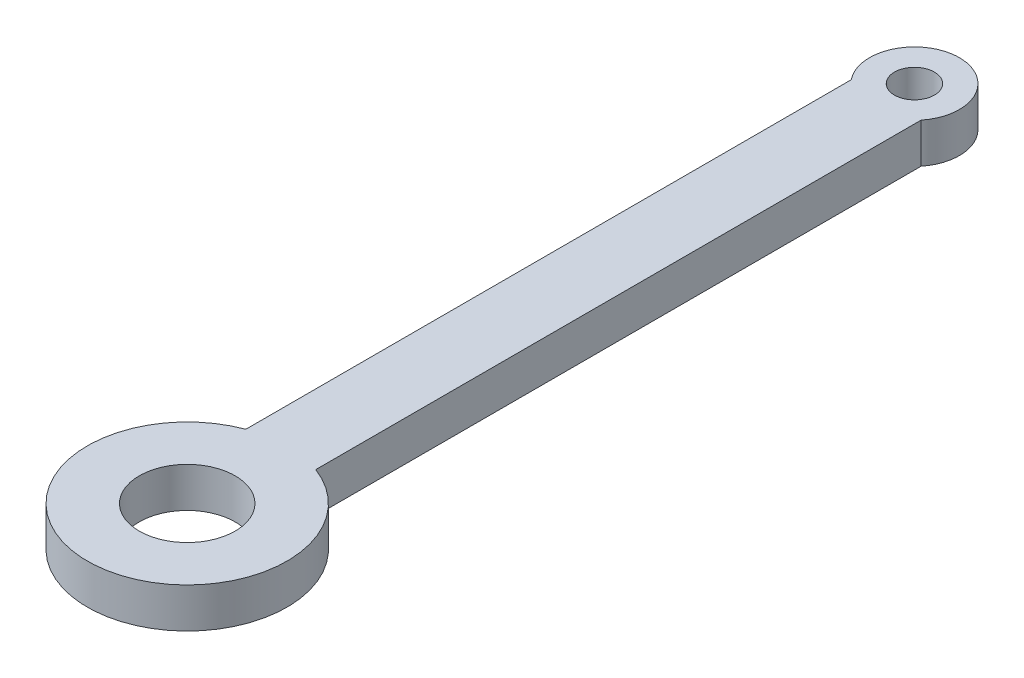
ISO-10303-21;
HEADER;
FILE_DESCRIPTION(('STEP AP214'),'2;1');
FILE_NAME('part.step','',(''),(''),'','','');
FILE_SCHEMA(('AUTOMOTIVE_DESIGN { 1 0 10303 214 1 1 1 1 }'));
ENDSEC;
DATA;
#1=APPLICATION_CONTEXT('core data for automotive mechanical design processes');
#2=APPLICATION_PROTOCOL_DEFINITION('international standard','automotive_design',2000,#1);
#3=PRODUCT_CONTEXT('',#1,'mechanical');
#4=PRODUCT('Part','Part','',(#3));
#5=PRODUCT_RELATED_PRODUCT_CATEGORY('part','',(#4));
#6=PRODUCT_DEFINITION_FORMATION('','',#4);
#7=PRODUCT_DEFINITION_CONTEXT('part definition',#1,'design');
#8=PRODUCT_DEFINITION('design','',#6,#7);
#9=PRODUCT_DEFINITION_SHAPE('','',#8);
#10=(LENGTH_UNIT() NAMED_UNIT(*) SI_UNIT(.MILLI.,.METRE.));
#11=(NAMED_UNIT(*) PLANE_ANGLE_UNIT() SI_UNIT($,.RADIAN.));
#12=(NAMED_UNIT(*) SI_UNIT($,.STERADIAN.) SOLID_ANGLE_UNIT());
#13=UNCERTAINTY_MEASURE_WITH_UNIT(LENGTH_MEASURE(1.E-05),#10,'distance_accuracy_value','');
#14=(GEOMETRIC_REPRESENTATION_CONTEXT(3) GLOBAL_UNCERTAINTY_ASSIGNED_CONTEXT((#13)) GLOBAL_UNIT_ASSIGNED_CONTEXT((#10,
#11,#12)) REPRESENTATION_CONTEXT('',''));
#15=CARTESIAN_POINT('',(0.,0.,0.));
#16=DIRECTION('',(0.,0.,1.));
#17=DIRECTION('',(1.,0.,0.));
#18=AXIS2_PLACEMENT_3D('',#15,#16,#17);
#19=CARTESIAN_POINT('',(0.,2.,0.));
#20=DIRECTION('',(0.,1.,0.));
#21=DIRECTION('',(0.,0.,1.));
#22=AXIS2_PLACEMENT_3D('',#19,#20,#21);
#23=PLANE('',#22);
#24=CARTESIAN_POINT('',(0.,2.,0.));
#25=DIRECTION('',(0.,1.,0.));
#26=DIRECTION('',(0.,0.,1.));
#27=AXIS2_PLACEMENT_3D('',#24,#25,#26);
#28=CIRCLE('',#27,2.4);
#29=CARTESIAN_POINT('',(0.,2.,2.4));
#30=VERTEX_POINT('',#29);
#31=EDGE_CURVE('E118',#30,#30,#28,.T.);
#32=ORIENTED_EDGE('',*,*,#31,.F.);
#33=EDGE_LOOP('',(#32));
#34=FACE_BOUND('',#33,.T.);
#35=CARTESIAN_POINT('',(0.,2.,0.));
#36=DIRECTION('',(0.,1.,0.));
#37=DIRECTION('',(0.,0.,1.));
#38=AXIS2_PLACEMENT_3D('',#35,#36,#37);
#39=CIRCLE('',#38,5.);
#40=CARTESIAN_POINT('',(-1.74961626264366,2.,-4.68389185757878));
#41=VERTEX_POINT('',#40);
#42=CARTESIAN_POINT('',(1.75038373735634,2.,-4.68360510419041));
#43=VERTEX_POINT('',#42);
#44=EDGE_CURVE('E98',#41,#43,#39,.T.);
#45=ORIENTED_EDGE('',*,*,#44,.T.);
#46=DIRECTION('',(0.,0.,-1.));
#47=VECTOR('',#46,1.);
#48=CARTESIAN_POINT('',(1.75038373735634,2.,-4.68360510419041));
#49=LINE('',#48,#47);
#50=CARTESIAN_POINT('',(1.75038373735634,2.,-34.9962614202058));
#51=VERTEX_POINT('',#50);
#52=EDGE_CURVE('E93',#43,#51,#49,.T.);
#53=ORIENTED_EDGE('',*,*,#52,.T.);
#54=CARTESIAN_POINT('',(0.,2.,-36.41));
#55=DIRECTION('',(0.,1.,0.));
#56=DIRECTION('',(0.,0.,1.));
#57=AXIS2_PLACEMENT_3D('',#54,#55,#56);
#58=CIRCLE('',#57,2.25);
#59=CARTESIAN_POINT('',(-1.74961626264366,2.,-34.9953117186133));
#60=VERTEX_POINT('',#59);
#61=EDGE_CURVE('E96',#51,#60,#58,.T.);
#62=ORIENTED_EDGE('',*,*,#61,.T.);
#63=DIRECTION('',(0.,0.,1.));
#64=VECTOR('',#63,1.);
#65=CARTESIAN_POINT('',(-1.74961626264366,2.,-4.68389185757878));
#66=LINE('',#65,#64);
#67=EDGE_CURVE('E63',#60,#41,#66,.T.);
#68=ORIENTED_EDGE('',*,*,#67,.T.);
#69=EDGE_LOOP('',(#45,#53,#62,#68));
#70=FACE_BOUND('',#69,.T.);
#71=CARTESIAN_POINT('',(0.,2.,-36.41));
#72=DIRECTION('',(0.,1.,0.));
#73=DIRECTION('',(0.,0.,1.));
#74=AXIS2_PLACEMENT_3D('',#71,#72,#73);
#75=CIRCLE('',#74,1.);
#76=CARTESIAN_POINT('',(0.,2.,-35.41));
#77=VERTEX_POINT('',#76);
#78=EDGE_CURVE('E140',#77,#77,#75,.T.);
#79=ORIENTED_EDGE('',*,*,#78,.F.);
#80=EDGE_LOOP('',(#79));
#81=FACE_BOUND('',#80,.T.);
#82=ADVANCED_FACE('F45',(#34,#70,#81),#23,.T.);
#83=CARTESIAN_POINT('',(0.,0.,0.));
#84=DIRECTION('',(0.,1.,0.));
#85=DIRECTION('',(0.,0.,1.));
#86=AXIS2_PLACEMENT_3D('',#83,#84,#85);
#87=PLANE('',#86);
#88=CARTESIAN_POINT('',(0.,0.,0.));
#89=DIRECTION('',(0.,1.,0.));
#90=DIRECTION('',(0.,0.,1.));
#91=AXIS2_PLACEMENT_3D('',#88,#89,#90);
#92=CIRCLE('',#91,5.);
#93=CARTESIAN_POINT('',(-1.74961626264366,0.,-4.68389185757878));
#94=VERTEX_POINT('',#93);
#95=CARTESIAN_POINT('',(1.75038373735634,0.,-4.68360510419041));
#96=VERTEX_POINT('',#95);
#97=EDGE_CURVE('E114',#94,#96,#92,.T.);
#98=ORIENTED_EDGE('',*,*,#97,.F.);
#99=DIRECTION('',(0.,0.,1.));
#100=VECTOR('',#99,1.);
#101=CARTESIAN_POINT('',(-1.74961626264366,0.,-4.68389185757878));
#102=LINE('',#101,#100);
#103=CARTESIAN_POINT('',(-1.74961626264366,0.,-34.9953117186133));
#104=VERTEX_POINT('',#103);
#105=EDGE_CURVE('E86',#104,#94,#102,.T.);
#106=ORIENTED_EDGE('',*,*,#105,.F.);
#107=CARTESIAN_POINT('',(0.,0.,-36.41));
#108=DIRECTION('',(0.,1.,0.));
#109=DIRECTION('',(0.,0.,1.));
#110=AXIS2_PLACEMENT_3D('',#107,#108,#109);
#111=CIRCLE('',#110,2.25);
#112=CARTESIAN_POINT('',(1.75038373735634,0.,-34.9962614202058));
#113=VERTEX_POINT('',#112);
#114=EDGE_CURVE('E80',#113,#104,#111,.T.);
#115=ORIENTED_EDGE('',*,*,#114,.F.);
#116=DIRECTION('',(0.,0.,-1.));
#117=VECTOR('',#116,1.);
#118=CARTESIAN_POINT('',(1.75038373735634,0.,-4.68360510419041));
#119=LINE('',#118,#117);
#120=EDGE_CURVE('E103',#96,#113,#119,.T.);
#121=ORIENTED_EDGE('',*,*,#120,.F.);
#122=EDGE_LOOP('',(#98,#106,#115,#121));
#123=FACE_BOUND('',#122,.T.);
#124=CARTESIAN_POINT('',(0.,0.,0.));
#125=DIRECTION('',(0.,1.,0.));
#126=DIRECTION('',(0.,0.,1.));
#127=AXIS2_PLACEMENT_3D('',#124,#125,#126);
#128=CIRCLE('',#127,2.4);
#129=CARTESIAN_POINT('',(0.,0.,2.4));
#130=VERTEX_POINT('',#129);
#131=EDGE_CURVE('E136',#130,#130,#128,.T.);
#132=ORIENTED_EDGE('',*,*,#131,.T.);
#133=EDGE_LOOP('',(#132));
#134=FACE_BOUND('',#133,.T.);
#135=CARTESIAN_POINT('',(0.,0.,-36.41));
#136=DIRECTION('',(0.,1.,0.));
#137=DIRECTION('',(0.,0.,1.));
#138=AXIS2_PLACEMENT_3D('',#135,#136,#137);
#139=CIRCLE('',#138,1.);
#140=CARTESIAN_POINT('',(0.,0.,-35.41));
#141=VERTEX_POINT('',#140);
#142=EDGE_CURVE('E144',#141,#141,#139,.T.);
#143=ORIENTED_EDGE('',*,*,#142,.T.);
#144=EDGE_LOOP('',(#143));
#145=FACE_BOUND('',#144,.T.);
#146=ADVANCED_FACE('F131',(#123,#134,#145),#87,.F.);
#147=CARTESIAN_POINT('',(0.,2.,0.));
#148=DIRECTION('',(0.,-1.,0.));
#149=DIRECTION('',(0.,0.,-1.));
#150=AXIS2_PLACEMENT_3D('',#147,#148,#149);
#151=CYLINDRICAL_SURFACE('',#150,5.);
#152=ORIENTED_EDGE('',*,*,#97,.T.);
#153=DIRECTION('',(0.,-1.,0.));
#154=VECTOR('',#153,1.);
#155=CARTESIAN_POINT('',(1.75038373735634,2.,-4.68360510419041));
#156=LINE('',#155,#154);
#157=EDGE_CURVE('E11',#43,#96,#156,.T.);
#158=ORIENTED_EDGE('',*,*,#157,.F.);
#159=ORIENTED_EDGE('',*,*,#44,.F.);
#160=DIRECTION('',(0.,-1.,0.));
#161=VECTOR('',#160,1.);
#162=CARTESIAN_POINT('',(-1.74961626264366,2.,-4.68389185757878));
#163=LINE('',#162,#161);
#164=EDGE_CURVE('E110',#41,#94,#163,.T.);
#165=ORIENTED_EDGE('',*,*,#164,.T.);
#166=EDGE_LOOP('',(#152,#158,#159,#165));
#167=FACE_BOUND('',#166,.T.);
#168=ADVANCED_FACE('F47',(#167),#151,.T.);
#169=CARTESIAN_POINT('',(1.75038373735634,2.,-4.68360510419041));
#170=DIRECTION('',(-1.,0.,0.));
#171=DIRECTION('',(0.,0.,1.));
#172=AXIS2_PLACEMENT_3D('',#169,#170,#171);
#173=PLANE('',#172);
#174=ORIENTED_EDGE('',*,*,#120,.T.);
#175=DIRECTION('',(0.,-1.,0.));
#176=VECTOR('',#175,1.);
#177=CARTESIAN_POINT('',(1.75038373735634,2.,-34.9962614202058));
#178=LINE('',#177,#176);
#179=EDGE_CURVE('E55',#51,#113,#178,.T.);
#180=ORIENTED_EDGE('',*,*,#179,.F.);
#181=ORIENTED_EDGE('',*,*,#52,.F.);
#182=ORIENTED_EDGE('',*,*,#157,.T.);
#183=EDGE_LOOP('',(#174,#180,#181,#182));
#184=FACE_BOUND('',#183,.T.);
#185=ADVANCED_FACE('F102',(#184),#173,.F.);
#186=CARTESIAN_POINT('',(0.,2.,-36.41));
#187=DIRECTION('',(0.,-1.,0.));
#188=DIRECTION('',(0.,0.,-1.));
#189=AXIS2_PLACEMENT_3D('',#186,#187,#188);
#190=CYLINDRICAL_SURFACE('',#189,2.25);
#191=ORIENTED_EDGE('',*,*,#114,.T.);
#192=DIRECTION('',(0.,-1.,0.));
#193=VECTOR('',#192,1.);
#194=CARTESIAN_POINT('',(-1.74961626264366,2.,-34.9953117186133));
#195=LINE('',#194,#193);
#196=EDGE_CURVE('E105',#60,#104,#195,.T.);
#197=ORIENTED_EDGE('',*,*,#196,.F.);
#198=ORIENTED_EDGE('',*,*,#61,.F.);
#199=ORIENTED_EDGE('',*,*,#179,.T.);
#200=EDGE_LOOP('',(#191,#197,#198,#199));
#201=FACE_BOUND('',#200,.T.);
#202=ADVANCED_FACE('F106',(#201),#190,.T.);
#203=CARTESIAN_POINT('',(-1.74961626264366,2.,-4.68389185757878));
#204=DIRECTION('',(1.,0.,0.));
#205=DIRECTION('',(0.,0.,-1.));
#206=AXIS2_PLACEMENT_3D('',#203,#204,#205);
#207=PLANE('',#206);
#208=ORIENTED_EDGE('',*,*,#105,.T.);
#209=ORIENTED_EDGE('',*,*,#164,.F.);
#210=ORIENTED_EDGE('',*,*,#67,.F.);
#211=ORIENTED_EDGE('',*,*,#196,.T.);
#212=EDGE_LOOP('',(#208,#209,#210,#211));
#213=FACE_BOUND('',#212,.T.);
#214=ADVANCED_FACE('F128',(#213),#207,.F.);
#215=CARTESIAN_POINT('',(0.,2.,0.));
#216=DIRECTION('',(0.,-1.,0.));
#217=DIRECTION('',(0.,0.,-1.));
#218=AXIS2_PLACEMENT_3D('',#215,#216,#217);
#219=CYLINDRICAL_SURFACE('',#218,2.4);
#220=ORIENTED_EDGE('',*,*,#31,.T.);
#221=EDGE_LOOP('',(#220));
#222=FACE_BOUND('',#221,.T.);
#223=ORIENTED_EDGE('',*,*,#131,.F.);
#224=EDGE_LOOP('',(#223));
#225=FACE_BOUND('',#224,.T.);
#226=ADVANCED_FACE('F163',(#222,#225),#219,.F.);
#227=CARTESIAN_POINT('',(0.,2.,-36.41));
#228=DIRECTION('',(0.,-1.,0.));
#229=DIRECTION('',(0.,0.,-1.));
#230=AXIS2_PLACEMENT_3D('',#227,#228,#229);
#231=CYLINDRICAL_SURFACE('',#230,1.);
#232=ORIENTED_EDGE('',*,*,#78,.T.);
#233=EDGE_LOOP('',(#232));
#234=FACE_BOUND('',#233,.T.);
#235=ORIENTED_EDGE('',*,*,#142,.F.);
#236=EDGE_LOOP('',(#235));
#237=FACE_BOUND('',#236,.T.);
#238=ADVANCED_FACE('F152',(#234,#237),#231,.F.);
#239=CLOSED_SHELL('',(#82,#146,#168,#185,#202,#214,#226,#238));
#240=MANIFOLD_SOLID_BREP('B2',#239);
#241=ADVANCED_BREP_SHAPE_REPRESENTATION('',(#18,#240),#14);
#242=SHAPE_DEFINITION_REPRESENTATION(#9,#241);
ENDSEC;
END-ISO-10303-21;
